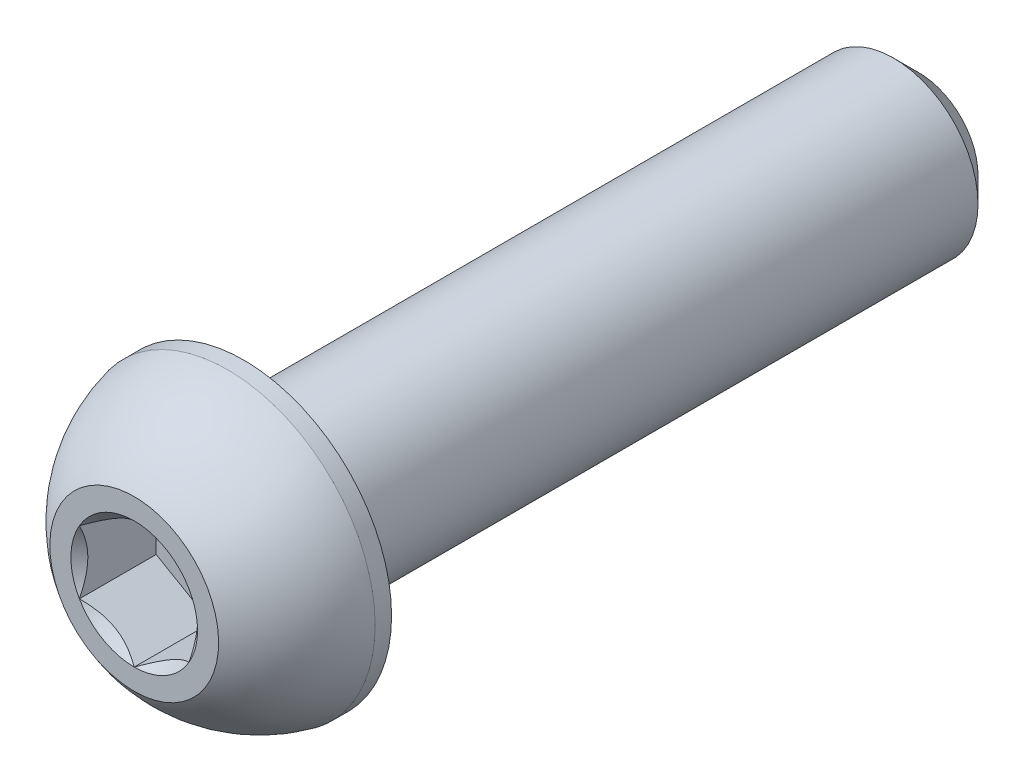
ISO-10303-21;
HEADER;
FILE_DESCRIPTION(('STEP AP214'),'2;1');
FILE_NAME('part.step','',(''),(''),'','','');
FILE_SCHEMA(('AUTOMOTIVE_DESIGN { 1 0 10303 214 1 1 1 1 }'));
ENDSEC;
DATA;
#1=APPLICATION_CONTEXT('core data for automotive mechanical design processes');
#2=APPLICATION_PROTOCOL_DEFINITION('international standard','automotive_design',2000,#1);
#3=PRODUCT_CONTEXT('',#1,'mechanical');
#4=PRODUCT('Part','Part','',(#3));
#5=PRODUCT_RELATED_PRODUCT_CATEGORY('part','',(#4));
#6=PRODUCT_DEFINITION_FORMATION('','',#4);
#7=PRODUCT_DEFINITION_CONTEXT('part definition',#1,'design');
#8=PRODUCT_DEFINITION('design','',#6,#7);
#9=PRODUCT_DEFINITION_SHAPE('','',#8);
#10=(LENGTH_UNIT() NAMED_UNIT(*) SI_UNIT(.MILLI.,.METRE.));
#11=(NAMED_UNIT(*) PLANE_ANGLE_UNIT() SI_UNIT($,.RADIAN.));
#12=(NAMED_UNIT(*) SI_UNIT($,.STERADIAN.) SOLID_ANGLE_UNIT());
#13=UNCERTAINTY_MEASURE_WITH_UNIT(LENGTH_MEASURE(1.E-05),#10,'distance_accuracy_value','');
#14=(GEOMETRIC_REPRESENTATION_CONTEXT(3) GLOBAL_UNCERTAINTY_ASSIGNED_CONTEXT((#13)) GLOBAL_UNIT_ASSIGNED_CONTEXT((#10,
#11,#12)) REPRESENTATION_CONTEXT('',''));
#15=CARTESIAN_POINT('',(0.,0.,0.));
#16=DIRECTION('',(0.,0.,1.));
#17=DIRECTION('',(1.,0.,0.));
#18=AXIS2_PLACEMENT_3D('',#15,#16,#17);
#19=CARTESIAN_POINT('',(0.,0.,-9.3));
#20=DIRECTION('',(0.,0.,1.));
#21=DIRECTION('',(1.,0.,0.));
#22=AXIS2_PLACEMENT_3D('',#19,#20,#21);
#23=PLANE('',#22);
#24=CARTESIAN_POINT('',(0.,0.,-9.3));
#25=DIRECTION('',(0.,0.,1.));
#26=DIRECTION('',(1.,0.,0.));
#27=AXIS2_PLACEMENT_3D('',#24,#25,#26);
#28=CIRCLE('',#27,0.700000000000034);
#29=CARTESIAN_POINT('',(0.700000000000034,0.,-9.3));
#30=VERTEX_POINT('',#29);
#31=EDGE_CURVE('E49',#30,#30,#28,.T.);
#32=ORIENTED_EDGE('',*,*,#31,.F.);
#33=EDGE_LOOP('',(#32));
#34=FACE_BOUND('',#33,.T.);
#35=ADVANCED_FACE('F36',(#34),#23,.F.);
#36=CARTESIAN_POINT('',(0.,0.,-9.3));
#37=DIRECTION('',(0.,0.,1.));
#38=DIRECTION('',(1.,0.,0.));
#39=AXIS2_PLACEMENT_3D('',#36,#37,#38);
#40=CONICAL_SURFACE('',#39,0.700000000000034,0.785398163397425);
#41=CARTESIAN_POINT('',(0.,0.,-9.00000000000001));
#42=DIRECTION('',(0.,0.,1.));
#43=DIRECTION('',(1.,0.,0.));
#44=AXIS2_PLACEMENT_3D('',#41,#42,#43);
#45=CIRCLE('',#44,1.00000000000001);
#46=CARTESIAN_POINT('',(1.00000000000001,0.,-9.00000000000001));
#47=VERTEX_POINT('',#46);
#48=EDGE_CURVE('E175',#47,#47,#45,.T.);
#49=ORIENTED_EDGE('',*,*,#48,.F.);
#50=EDGE_LOOP('',(#49));
#51=FACE_BOUND('',#50,.T.);
#52=ORIENTED_EDGE('',*,*,#31,.T.);
#53=EDGE_LOOP('',(#52));
#54=FACE_BOUND('',#53,.T.);
#55=ADVANCED_FACE('F180',(#51,#54),#40,.T.);
#56=CARTESIAN_POINT('',(0.,0.,0.));
#57=DIRECTION('',(0.,0.,1.));
#58=DIRECTION('',(1.,0.,0.));
#59=AXIS2_PLACEMENT_3D('',#56,#57,#58);
#60=CYLINDRICAL_SURFACE('',#59,1.00000000000001);
#61=CARTESIAN_POINT('',(0.,0.,-1.3));
#62=DIRECTION('',(0.,0.,1.));
#63=DIRECTION('',(1.,0.,0.));
#64=AXIS2_PLACEMENT_3D('',#61,#62,#63);
#65=CIRCLE('',#64,1.00000000000001);
#66=CARTESIAN_POINT('',(1.00000000000001,0.,-1.3));
#67=VERTEX_POINT('',#66);
#68=EDGE_CURVE('E172',#67,#67,#65,.T.);
#69=ORIENTED_EDGE('',*,*,#68,.F.);
#70=EDGE_LOOP('',(#69));
#71=FACE_BOUND('',#70,.T.);
#72=ORIENTED_EDGE('',*,*,#48,.T.);
#73=EDGE_LOOP('',(#72));
#74=FACE_BOUND('',#73,.T.);
#75=ADVANCED_FACE('F186',(#71,#74),#60,.T.);
#76=CARTESIAN_POINT('',(0.,-1.75,-1.3));
#77=DIRECTION('',(0.,0.,1.));
#78=DIRECTION('',(1.,0.,0.));
#79=AXIS2_PLACEMENT_3D('',#76,#77,#78);
#80=PLANE('',#79);
#81=CARTESIAN_POINT('',(0.,0.,-1.3));
#82=DIRECTION('',(0.,0.,1.));
#83=DIRECTION('',(1.,0.,0.));
#84=AXIS2_PLACEMENT_3D('',#81,#82,#83);
#85=CIRCLE('',#84,1.75);
#86=CARTESIAN_POINT('',(1.75,0.,-1.3));
#87=VERTEX_POINT('',#86);
#88=EDGE_CURVE('E166',#87,#87,#85,.T.);
#89=ORIENTED_EDGE('',*,*,#88,.F.);
#90=EDGE_LOOP('',(#89));
#91=FACE_BOUND('',#90,.T.);
#92=ORIENTED_EDGE('',*,*,#68,.T.);
#93=EDGE_LOOP('',(#92));
#94=FACE_BOUND('',#93,.T.);
#95=ADVANCED_FACE('F191',(#91,#94),#80,.F.);
#96=CARTESIAN_POINT('',(0.,0.,-1.48575791855203));
#97=DIRECTION('',(0.,0.,1.));
#98=DIRECTION('',(0.,-1.,0.));
#99=AXIS2_PLACEMENT_3D('',#96,#97,#98);
#100=SPHERICAL_SURFACE('',#99,1.79094293391502);
#101=CARTESIAN_POINT('',(0.,0.,0.));
#102=DIRECTION('',(0.,0.,1.));
#103=DIRECTION('',(1.,0.,0.));
#104=AXIS2_PLACEMENT_3D('',#101,#102,#103);
#105=CIRCLE('',#104,1.00000000000001);
#106=CARTESIAN_POINT('',(0.,-1.00000000000001,0.));
#107=VERTEX_POINT('',#106);
#108=EDGE_CURVE('E169',#107,#107,#105,.T.);
#109=CARTESIAN_POINT('',(0.,0.,-1.105));
#110=DIRECTION('',(0.,0.,1.));
#111=DIRECTION('',(1.,0.,0.));
#112=AXIS2_PLACEMENT_3D('',#109,#110,#111);
#113=CIRCLE('',#112,1.75);
#114=CARTESIAN_POINT('',(0.,-1.75,-1.105));
#115=VERTEX_POINT('',#114);
#116=EDGE_CURVE('E163',#115,#115,#113,.T.);
#117=CARTESIAN_POINT('',(0.,-1.00000000000001,0.));
#118=CARTESIAN_POINT('',(0.,-1.01182643004198,-0.00795982137329927));
#119=CARTESIAN_POINT('',(0.,-1.02355778185813,-0.0160609033918179));
#120=CARTESIAN_POINT('',(0.,-1.04682372823727,-0.0325408445171076));
#121=CARTESIAN_POINT('',(0.,-1.05835832280026,-0.0409197036238785));
#122=CARTESIAN_POINT('',(0.,-1.0812241538715,-0.0579504547234862));
#123=CARTESIAN_POINT('',(0.,-1.09255539037975,-0.0666023467163229));
#124=CARTESIAN_POINT('',(0.,-1.11500805055769,-0.0841742212604434));
#125=CARTESIAN_POINT('',(0.,-1.12612947422739,-0.0930942038117272));
#126=CARTESIAN_POINT('',(0.,-1.14815616552584,-0.111197175650233));
#127=CARTESIAN_POINT('',(0.,-1.1590614331546,-0.120380164937455));
#128=CARTESIAN_POINT('',(0.,-1.18064959458059,-0.139003913410275));
#129=CARTESIAN_POINT('',(0.,-1.19133248837781,-0.148444672595872));
#130=CARTESIAN_POINT('',(0.,-1.21246981057065,-0.167578577862459));
#131=CARTESIAN_POINT('',(0.,-1.22292423896626,-0.177271723943447));
#132=CARTESIAN_POINT('',(0.,-1.24359866921303,-0.196904875866591));
#133=CARTESIAN_POINT('',(0.,-1.2538186710642,-0.206844881708745));
#134=CARTESIAN_POINT('',(0.,-1.27401842070911,-0.226966085317752));
#135=CARTESIAN_POINT('',(0.,-1.28399816850286,-0.237147283084603));
#136=CARTESIAN_POINT('',(0.,-1.30371171952533,-0.257745065161795));
#137=CARTESIAN_POINT('',(0.,-1.31344552275405,-0.268161649472135));
#138=CARTESIAN_POINT('',(0.,-1.33266163437493,-0.289224265040536));
#139=CARTESIAN_POINT('',(0.,-1.34214394276707,-0.299870296298597));
#140=CARTESIAN_POINT('',(0.,-1.36085165784783,-0.321385735333565));
#141=CARTESIAN_POINT('',(0.,-1.37007706453644,-0.332255143110472));
#142=CARTESIAN_POINT('',(0.,-1.3882657158298,-0.354211137383978));
#143=CARTESIAN_POINT('',(0.,-1.39722896043454,-0.365297723880577));
#144=CARTESIAN_POINT('',(0.,-1.41488817666624,-0.387681753957667));
#145=CARTESIAN_POINT('',(0.,-1.42358414829318,-0.398979197538157));
#146=CARTESIAN_POINT('',(0.,-1.44070386007593,-0.421778499915324));
#147=CARTESIAN_POINT('',(0.,-1.44912760023172,-0.433280358712));
#148=CARTESIAN_POINT('',(0.,-1.46569804580678,-0.456481933095085));
#149=CARTESIAN_POINT('',(0.,-1.47384475122604,-0.468181648681495));
#150=CARTESIAN_POINT('',(0.,-1.48985648202944,-0.491772265398509));
#151=CARTESIAN_POINT('',(0.,-1.49772150741359,-0.503663166529114));
#152=CARTESIAN_POINT('',(0.,-1.51316539346377,-0.527629374073879));
#153=CARTESIAN_POINT('',(0.,-1.5207442541298,-0.539704680488038));
#154=CARTESIAN_POINT('',(0.,-1.53561148923356,-0.564032813190312));
#155=CARTESIAN_POINT('',(0.,-1.54289986367127,-0.576285639478425));
#156=CARTESIAN_POINT('',(0.,-1.55718197044511,-0.600961825296145));
#157=CARTESIAN_POINT('',(0.,-1.56417570278122,-0.61338518482575));
#158=CARTESIAN_POINT('',(0.,-1.57786453748518,-0.638395353254957));
#159=CARTESIAN_POINT('',(0.,-1.58455963985302,-0.650982162154558));
#160=CARTESIAN_POINT('',(0.,-1.59764739703439,-0.676312052252457));
#161=CARTESIAN_POINT('',(0.,-1.60404005184792,-0.689055133450757));
#162=CARTESIAN_POINT('',(0.,-1.61651926879161,-0.714690301967474));
#163=CARTESIAN_POINT('',(0.,-1.62260583092177,-0.727582389285892));
#164=CARTESIAN_POINT('',(0.,-1.63446939190682,-0.753508218899792));
#165=CARTESIAN_POINT('',(0.,-1.64024639076172,-0.766541961195273));
#166=CARTESIAN_POINT('',(0.,-1.65148753111412,-0.79274366884897));
#167=CARTESIAN_POINT('',(0.,-1.65695167261162,-0.805911634207186));
#168=CARTESIAN_POINT('',(0.,-1.66756398257888,-0.832374279532718));
#169=CARTESIAN_POINT('',(0.,-1.67271215104863,-0.845668959500033));
#170=CARTESIAN_POINT('',(0.,-1.68268957938988,-0.872377453353669));
#171=CARTESIAN_POINT('',(0.,-1.68751883926138,-0.885791267239989));
#172=CARTESIAN_POINT('',(0.,-1.69685569693965,-0.912730380247454));
#173=CARTESIAN_POINT('',(0.,-1.70136329474644,-0.926255679368598));
#174=CARTESIAN_POINT('',(0.,-1.7100542572701,-0.953410050828004));
#175=CARTESIAN_POINT('',(0.,-1.71423762198697,-0.967039123166265));
#176=CARTESIAN_POINT('',(0.,-1.72227773581392,-0.994393268989346));
#177=CARTESIAN_POINT('',(0.,-1.72613448492398,-1.00811834247417));
#178=CARTESIAN_POINT('',(0.,-1.73351915771601,-1.03565666706645));
#179=CARTESIAN_POINT('',(0.,-1.73704708139798,-1.04946991817391));
#180=CARTESIAN_POINT('',(0.,-1.74377213155194,-1.07717671194072));
#181=CARTESIAN_POINT('',(0.,-1.74696925802394,-1.09107025460008));
#182=CARTESIAN_POINT('',(0.,-1.75,-1.105));
#183=B_SPLINE_CURVE_WITH_KNOTS('',3,(#117,#118,#119,#120,#121,#122,#123,#124,#125,#126,#127,
#128,#129,#130,#131,#132,#133,#134,#135,#136,#137,#138,#139,#140,#141,#142,#143,#144,#145,#146,
#147,#148,#149,#150,#151,#152,#153,#154,#155,#156,#157,#158,#159,#160,#161,#162,#163,#164,#165,
#166,#167,#168,#169,#170,#171,#172,#173,#174,#175,#176,#177,#178,#179,#180,#181,#182),
.UNSPECIFIED.,.F.,.F.,(4,2,2,2,2,2,2,2,2,2,2,2,2,2,2,2,2,2,2,2,2,2,2,2,2,2,2,2,2,2,2,2,4),(0.,
0.0427658943058258,0.0855317886116518,0.128297682917478,0.171063577223303,0.213829471529129,
0.256595365834955,0.299361260140781,0.342127154446607,0.384893048752432,0.427658943058258,
0.470424837364084,0.51319073166991,0.555956625975736,0.598722520281562,0.641488414587387,
0.684254308893213,0.727020203199039,0.769786097504865,0.812551991810691,0.855317886116516,
0.898083780422342,0.940849674728168,0.983615569033994,1.02638146333982,1.06914735764565,
1.11191325195147,1.1546791462573,1.19744504056312,1.24021093486895,1.28297682917477,
1.3257427234806,1.36850861778643),.UNSPECIFIED.);
#184=EDGE_CURVE('BSEAM196',#107,#115,#183,.T.);
#185=ORIENTED_EDGE('',*,*,#108,.F.);
#186=ORIENTED_EDGE('',*,*,#116,.T.);
#187=ORIENTED_EDGE('',*,*,#184,.T.);
#188=ORIENTED_EDGE('',*,*,#184,.F.);
#189=EDGE_LOOP('',(#185,#187,#186,#188));
#190=FACE_BOUND('',#189,.T.);
#191=ADVANCED_FACE('F196',(#190),#100,.T.);
#192=CARTESIAN_POINT('',(0.,-1.00000000000001,0.));
#193=DIRECTION('',(0.,0.,-1.));
#194=DIRECTION('',(-1.,0.,0.));
#195=AXIS2_PLACEMENT_3D('',#192,#193,#194);
#196=PLANE('',#195);
#197=CARTESIAN_POINT('',(0.,0.,0.));
#198=DIRECTION('',(0.,0.,1.));
#199=DIRECTION('',(1.,0.,0.));
#200=AXIS2_PLACEMENT_3D('',#197,#198,#199);
#201=CIRCLE('',#200,0.750555349946512);
#202=CARTESIAN_POINT('',(-0.649999999999998,0.375277674973256,0.));
#203=VERTEX_POINT('',#202);
#204=CARTESIAN_POINT('',(-0.649999999999997,-0.375277674973259,0.));
#205=VERTEX_POINT('',#204);
#206=EDGE_CURVE('E62',#203,#205,#201,.T.);
#207=ORIENTED_EDGE('',*,*,#206,.F.);
#208=CARTESIAN_POINT('',(0.,0.750555349946512,0.));
#209=VERTEX_POINT('',#208);
#210=EDGE_CURVE('E134',#209,#203,#201,.T.);
#211=ORIENTED_EDGE('',*,*,#210,.F.);
#212=CARTESIAN_POINT('',(0.65,0.375277674973254,0.));
#213=VERTEX_POINT('',#212);
#214=EDGE_CURVE('E131',#213,#209,#201,.T.);
#215=ORIENTED_EDGE('',*,*,#214,.F.);
#216=CARTESIAN_POINT('',(0.65,-0.375277674973254,0.));
#217=VERTEX_POINT('',#216);
#218=EDGE_CURVE('E102',#217,#213,#201,.T.);
#219=ORIENTED_EDGE('',*,*,#218,.F.);
#220=CARTESIAN_POINT('',(0.,-0.750555349946512,0.));
#221=VERTEX_POINT('',#220);
#222=EDGE_CURVE('E94',#221,#217,#201,.T.);
#223=ORIENTED_EDGE('',*,*,#222,.F.);
#224=EDGE_CURVE('E55',#205,#221,#201,.T.);
#225=ORIENTED_EDGE('',*,*,#224,.F.);
#226=EDGE_LOOP('',(#207,#211,#215,#219,#223,#225));
#227=FACE_BOUND('',#226,.T.);
#228=ORIENTED_EDGE('',*,*,#108,.T.);
#229=EDGE_LOOP('',(#228));
#230=FACE_BOUND('',#229,.T.);
#231=ADVANCED_FACE('F128',(#227,#230),#196,.F.);
#232=CARTESIAN_POINT('',(0.,0.,0.));
#233=DIRECTION('',(0.,0.,1.));
#234=DIRECTION('',(1.,0.,0.));
#235=AXIS2_PLACEMENT_3D('',#232,#233,#234);
#236=CYLINDRICAL_SURFACE('',#235,1.75);
#237=ORIENTED_EDGE('',*,*,#116,.F.);
#238=EDGE_LOOP('',(#237));
#239=FACE_BOUND('',#238,.T.);
#240=ORIENTED_EDGE('',*,*,#88,.T.);
#241=EDGE_LOOP('',(#240));
#242=FACE_BOUND('',#241,.T.);
#243=ADVANCED_FACE('F202',(#239,#242),#236,.T.);
#244=CARTESIAN_POINT('',(0.,0.,0.));
#245=DIRECTION('',(0.,0.,1.));
#246=DIRECTION('',(1.,0.,0.));
#247=AXIS2_PLACEMENT_3D('',#244,#245,#246);
#248=CONICAL_SURFACE('',#247,0.750555349946512,0.78539816339745);
#249=ORIENTED_EDGE('',*,*,#218,.T.);
#250=CARTESIAN_POINT('',(0.65,-0.748456856201993,0.240750690384005));
#251=CARTESIAN_POINT('',(0.65,-0.711991073878816,0.213280285933621));
#252=CARTESIAN_POINT('',(0.65,-0.675139640082794,0.186265195476194));
#253=CARTESIAN_POINT('',(0.65,-0.600031183452819,0.133629348283163));
#254=CARTESIAN_POINT('',(0.65,-0.561765441270894,0.108021106129097));
#255=CARTESIAN_POINT('',(0.65,-0.481525479406319,0.0577374937624613));
#256=CARTESIAN_POINT('',(0.65,-0.439464253670484,0.0331988021987558));
#257=CARTESIAN_POINT('',(0.65,-0.353242719412717,-0.0116853403013637));
#258=CARTESIAN_POINT('',(0.65,-0.309090130602523,-0.0320449275105113));
#259=CARTESIAN_POINT('',(0.65,-0.242810057498668,-0.0569512709113473));
#260=CARTESIAN_POINT('',(0.65,-0.221667349821687,-0.0640992725852869));
#261=CARTESIAN_POINT('',(0.65,-0.178882845085541,-0.0767024705474531));
#262=CARTESIAN_POINT('',(0.65,-0.157241013753962,-0.0821575502168733));
#263=CARTESIAN_POINT('',(0.65,-0.0924732258239327,-0.0953392346897749));
#264=CARTESIAN_POINT('',(0.65,-0.0486986201802761,-0.100206440230559));
#265=CARTESIAN_POINT('',(0.65,0.0373331587621249,-0.10085551076922));
#266=CARTESIAN_POINT('',(0.65,0.0795879418799275,-0.0969596606801929));
#267=CARTESIAN_POINT('',(0.65,0.142230570834976,-0.0855076744021655));
#268=CARTESIAN_POINT('',(0.65,0.163174856664669,-0.080685435763269));
#269=CARTESIAN_POINT('',(0.65,0.204615212735414,-0.0693999000452562));
#270=CARTESIAN_POINT('',(0.65,0.225111320324617,-0.0629367402798553));
#271=CARTESIAN_POINT('',(0.65,0.289638534772371,-0.0401559078683569));
#272=CARTESIAN_POINT('',(0.65,0.332748206875051,-0.0212427548657985));
#273=CARTESIAN_POINT('',(0.65,0.416943840013234,0.0208112818887808));
#274=CARTESIAN_POINT('',(0.65,0.45802183453077,0.0439673547577785));
#275=CARTESIAN_POINT('',(0.65,0.53652923324599,0.0917266397180912));
#276=CARTESIAN_POINT('',(0.65,0.574038509134623,0.116200758127156));
#277=CARTESIAN_POINT('',(0.65,0.647609691485458,0.166623456014885));
#278=CARTESIAN_POINT('',(0.65,0.683680924535921,0.192558343655291));
#279=CARTESIAN_POINT('',(0.65,0.719356204751142,0.218966877397434));
#280=B_SPLINE_CURVE_WITH_KNOTS('',3,(#250,#251,#252,#253,#254,#255,#256,#257,#258,#259,#260,
#261,#262,#263,#264,#265,#266,#267,#268,#269,#270,#271,#272,#273,#274,#275,#276,#277,#278,#279),
.UNSPECIFIED.,.F.,.F.,(4,2,2,2,2,2,2,2,2,2,2,2,2,2,4),(0.,0.137014030009578,0.275096405762551,
0.421060359835522,0.566522128775089,0.633415056462916,0.7003125911218,0.831534924508334,
0.958010408789896,1.02242898521265,1.08684217280828,1.22766018796412,1.36899252873703,
1.50330165960873,1.63651263433843),.UNSPECIFIED.);
#281=EDGE_CURVE('E11',#217,#213,#280,.T.);
#282=ORIENTED_EDGE('',*,*,#281,.F.);
#283=EDGE_LOOP('',(#249,#282));
#284=FACE_BOUND('',#283,.T.);
#285=ADVANCED_FACE('F106',(#284),#248,.F.);
#286=ORIENTED_EDGE('',*,*,#214,.T.);
#287=CARTESIAN_POINT('',(0.6502,0.375162204919418,0.000115496696675192));
#288=CARTESIAN_POINT('',(0.62784612455738,0.388068220923646,-0.0127826378084528));
#289=CARTESIAN_POINT('',(0.605119879467388,0.401189224644023,-0.0249248451013623));
#290=CARTESIAN_POINT('',(0.558778015356718,0.427944712363067,-0.0471577551377729));
#291=CARTESIAN_POINT('',(0.535157980959404,0.441581745580624,-0.0572360751899923));
#292=CARTESIAN_POINT('',(0.487526191293144,0.469081972166423,-0.0744984835766245));
#293=CARTESIAN_POINT('',(0.463526635406914,0.482938122217769,-0.08172604148442));
#294=CARTESIAN_POINT('',(0.415010589754791,0.510948874235039,-0.0928707979999926));
#295=CARTESIAN_POINT('',(0.390495555958119,0.52510263559674,-0.0967962973781314));
#296=CARTESIAN_POINT('',(0.33061559766408,0.559674345636867,-0.101776562665292));
#297=CARTESIAN_POINT('',(0.295110807096765,0.580173046028428,-0.100875515207341));
#298=CARTESIAN_POINT('',(0.224845447682006,0.620740770201245,-0.0915914386833307));
#299=CARTESIAN_POINT('',(0.190086069560699,0.640809106516445,-0.083197236970343));
#300=CARTESIAN_POINT('',(0.129041737491061,0.676053068069352,-0.0629543214927018));
#301=CARTESIAN_POINT('',(0.102476138584915,0.691390723748998,-0.0521615767354971));
#302=CARTESIAN_POINT('',(0.0503858451009338,0.721465068714142,-0.0278480685503981));
#303=CARTESIAN_POINT('',(0.0248580811749648,0.736203530088609,-0.0143361789927107));
#304=CARTESIAN_POINT('',(-0.000199999999999354,0.75067082000035,0.000115496696673986));
#305=B_SPLINE_CURVE_WITH_KNOTS('',3,(#287,#288,#289,#290,#291,#292,#293,#294,#295,#296,#297,
#298,#299,#300,#301,#302,#303,#304),.UNSPECIFIED.,.F.,.F.,(4,2,2,2,2,2,2,2,4),(0.,
0.0866236559063445,0.173752711623243,0.259496442803569,0.345023980281753,0.467267720550126,
0.589694037029336,0.687111308755481,0.784215671813665),.UNSPECIFIED.);
#306=EDGE_CURVE('E133',#213,#209,#305,.T.);
#307=ORIENTED_EDGE('',*,*,#306,.F.);
#308=EDGE_LOOP('',(#286,#307));
#309=FACE_BOUND('',#308,.T.);
#310=ADVANCED_FACE('F289',(#309),#248,.F.);
#311=ORIENTED_EDGE('',*,*,#210,.T.);
#312=CARTESIAN_POINT('',(0.000200000000000687,0.75067082000035,0.000115496696674086));
#313=CARTESIAN_POINT('',(-0.0221538754426199,0.737764803996122,-0.0127826378084537));
#314=CARTESIAN_POINT('',(-0.0448801205326119,0.724643800275746,-0.0249248451013632));
#315=CARTESIAN_POINT('',(-0.0912219846432817,0.697888312556701,-0.0471577551377739));
#316=CARTESIAN_POINT('',(-0.114842019040596,0.684251279339144,-0.0572360751899933));
#317=CARTESIAN_POINT('',(-0.162473808706855,0.656751052753345,-0.0744984835766254));
#318=CARTESIAN_POINT('',(-0.186473364593085,0.642894902701999,-0.0817260414844208));
#319=CARTESIAN_POINT('',(-0.234989410245209,0.614884150684729,-0.0928707979999933));
#320=CARTESIAN_POINT('',(-0.25950444404188,0.600730389323028,-0.0967962973781321));
#321=CARTESIAN_POINT('',(-0.319384402335919,0.566158679282901,-0.101776562665293));
#322=CARTESIAN_POINT('',(-0.354889192903234,0.545659978891341,-0.100875515207342));
#323=CARTESIAN_POINT('',(-0.425154552317993,0.505092254718524,-0.0915914386833313));
#324=CARTESIAN_POINT('',(-0.4599139304393,0.485023918403323,-0.0831972369703435));
#325=CARTESIAN_POINT('',(-0.520958262508938,0.449779956850417,-0.0629543214927024));
#326=CARTESIAN_POINT('',(-0.547523861415084,0.43444230117077,-0.0521615767354977));
#327=CARTESIAN_POINT('',(-0.599614154899065,0.404367956205627,-0.0278480685503987));
#328=CARTESIAN_POINT('',(-0.625141918825034,0.389629494831159,-0.0143361789927112));
#329=CARTESIAN_POINT('',(-0.650199999999998,0.375162204919418,0.0001154966966736));
#330=B_SPLINE_CURVE_WITH_KNOTS('',3,(#312,#313,#314,#315,#316,#317,#318,#319,#320,#321,#322,
#323,#324,#325,#326,#327,#328,#329),.UNSPECIFIED.,.F.,.F.,(4,2,2,2,2,2,2,2,4),(0.,
0.0866236559063444,0.173752711623242,0.259496442803568,0.345023980281752,0.467267720550125,
0.589694037029335,0.68711130875548,0.784215671813665),.UNSPECIFIED.);
#331=EDGE_CURVE('E138',#209,#203,#330,.T.);
#332=ORIENTED_EDGE('',*,*,#331,.F.);
#333=EDGE_LOOP('',(#311,#332));
#334=FACE_BOUND('',#333,.T.);
#335=ADVANCED_FACE('F141',(#334),#248,.F.);
#336=ORIENTED_EDGE('',*,*,#206,.T.);
#337=CARTESIAN_POINT('',(-0.649999999999997,-0.748456856202,0.240750690384008));
#338=CARTESIAN_POINT('',(-0.649999999999997,-0.711991073878822,0.213280285933623));
#339=CARTESIAN_POINT('',(-0.649999999999997,-0.6751396400828,0.186265195476196));
#340=CARTESIAN_POINT('',(-0.649999999999997,-0.600031183452825,0.133629348283164));
#341=CARTESIAN_POINT('',(-0.649999999999997,-0.561765441270899,0.108021106129098));
#342=CARTESIAN_POINT('',(-0.649999999999997,-0.481525479406324,0.0577374937624617));
#343=CARTESIAN_POINT('',(-0.649999999999997,-0.439464253670489,0.0331988021987558));
#344=CARTESIAN_POINT('',(-0.649999999999997,-0.353242719412722,-0.0116853403013644));
#345=CARTESIAN_POINT('',(-0.649999999999997,-0.309090130602527,-0.0320449275105122));
#346=CARTESIAN_POINT('',(-0.649999999999997,-0.242810057498671,-0.0569512709113487));
#347=CARTESIAN_POINT('',(-0.649999999999998,-0.221667349821691,-0.0640992725852885));
#348=CARTESIAN_POINT('',(-0.649999999999998,-0.178882845085544,-0.076702470547455));
#349=CARTESIAN_POINT('',(-0.649999999999998,-0.157241013753965,-0.0821575502168752));
#350=CARTESIAN_POINT('',(-0.649999999999998,-0.092473225823936,-0.0953392346897771));
#351=CARTESIAN_POINT('',(-0.649999999999998,-0.0486986201802792,-0.100206440230561));
#352=CARTESIAN_POINT('',(-0.649999999999998,0.0373331587621221,-0.100855510769223));
#353=CARTESIAN_POINT('',(-0.649999999999998,0.0795879418799249,-0.0969596606801957));
#354=CARTESIAN_POINT('',(-0.649999999999998,0.142230570834973,-0.0855076744021684));
#355=CARTESIAN_POINT('',(-0.649999999999998,0.163174856664667,-0.080685435763272));
#356=CARTESIAN_POINT('',(-0.649999999999998,0.204615212735411,-0.0693999000452592));
#357=CARTESIAN_POINT('',(-0.649999999999998,0.225111320324615,-0.0629367402798583));
#358=CARTESIAN_POINT('',(-0.649999999999998,0.289638534772368,-0.0401559078683601));
#359=CARTESIAN_POINT('',(-0.649999999999998,0.332748206875048,-0.0212427548658018));
#360=CARTESIAN_POINT('',(-0.649999999999998,0.41694384001323,0.0208112818887772));
#361=CARTESIAN_POINT('',(-0.649999999999998,0.458021834530766,0.0439673547577745));
#362=CARTESIAN_POINT('',(-0.649999999999998,0.536529233245986,0.0917266397180868));
#363=CARTESIAN_POINT('',(-0.649999999999998,0.574038509134618,0.116200758127151));
#364=CARTESIAN_POINT('',(-0.649999999999999,0.647609691485453,0.166623456014881));
#365=CARTESIAN_POINT('',(-0.649999999999999,0.683680924535915,0.192558343655286));
#366=CARTESIAN_POINT('',(-0.649999999999999,0.719356204751137,0.218966877397429));
#367=B_SPLINE_CURVE_WITH_KNOTS('',3,(#337,#338,#339,#340,#341,#342,#343,#344,#345,#346,#347,
#348,#349,#350,#351,#352,#353,#354,#355,#356,#357,#358,#359,#360,#361,#362,#363,#364,#365,#366),
.UNSPECIFIED.,.F.,.F.,(4,2,2,2,2,2,2,2,2,2,2,2,2,2,4),(0.,0.13701403000958,0.275096405762553,
0.421060359835525,0.566522128775094,0.633415056462921,0.700312591121805,0.83153492450834,
0.958010408789902,1.02242898521266,1.08684217280828,1.22766018796413,1.36899252873703,
1.50330165960873,1.63651263433843),.UNSPECIFIED.);
#368=EDGE_CURVE('E145',#203,#205,#367,.F.);
#369=ORIENTED_EDGE('',*,*,#368,.F.);
#370=EDGE_LOOP('',(#336,#369));
#371=FACE_BOUND('',#370,.T.);
#372=ADVANCED_FACE('F283',(#371),#248,.F.);
#373=ORIENTED_EDGE('',*,*,#224,.T.);
#374=CARTESIAN_POINT('',(-0.650199999999997,-0.375162204919418,0.000115496696672807));
#375=CARTESIAN_POINT('',(-0.627846124557377,-0.388068220923647,-0.0127826378084549));
#376=CARTESIAN_POINT('',(-0.605119879467385,-0.401189224644023,-0.0249248451013643));
#377=CARTESIAN_POINT('',(-0.558778015356716,-0.427944712363067,-0.0471577551377746));
#378=CARTESIAN_POINT('',(-0.535157980959402,-0.441581745580625,-0.0572360751899938));
#379=CARTESIAN_POINT('',(-0.487526191293143,-0.469081972166423,-0.0744984835766257));
#380=CARTESIAN_POINT('',(-0.463526635406913,-0.482938122217769,-0.081726041484421));
#381=CARTESIAN_POINT('',(-0.41501058975479,-0.510948874235039,-0.0928707979999934));
#382=CARTESIAN_POINT('',(-0.390495555958118,-0.52510263559674,-0.096796297378132));
#383=CARTESIAN_POINT('',(-0.33061559766408,-0.559674345636867,-0.101776562665293));
#384=CARTESIAN_POINT('',(-0.295110807096765,-0.580173046028428,-0.100875515207342));
#385=CARTESIAN_POINT('',(-0.224845447682006,-0.620740770201245,-0.0915914386833309));
#386=CARTESIAN_POINT('',(-0.190086069560699,-0.640809106516445,-0.0831972369703432));
#387=CARTESIAN_POINT('',(-0.129041737491061,-0.676053068069351,-0.062954321492702));
#388=CARTESIAN_POINT('',(-0.102476138584916,-0.691390723748998,-0.0521615767354973));
#389=CARTESIAN_POINT('',(-0.0503858451009351,-0.721465068714141,-0.0278480685503986));
#390=CARTESIAN_POINT('',(-0.0248580811749664,-0.736203530088608,-0.0143361789927113));
#391=CARTESIAN_POINT('',(0.00019999999999743,-0.750670820000349,0.000115496696673118));
#392=B_SPLINE_CURVE_WITH_KNOTS('',3,(#374,#375,#376,#377,#378,#379,#380,#381,#382,#383,#384,
#385,#386,#387,#388,#389,#390,#391),.UNSPECIFIED.,.F.,.F.,(4,2,2,2,2,2,2,2,4),(0.,
0.0866236559063438,0.173752711623241,0.259496442803566,0.34502398028175,0.467267720550123,
0.589694037029333,0.687111308755476,0.78421567181366),.UNSPECIFIED.);
#393=EDGE_CURVE('E118',#205,#221,#392,.T.);
#394=ORIENTED_EDGE('',*,*,#393,.F.);
#395=EDGE_LOOP('',(#373,#394));
#396=FACE_BOUND('',#395,.T.);
#397=ADVANCED_FACE('F231',(#396),#248,.F.);
#398=ORIENTED_EDGE('',*,*,#222,.T.);
#399=CARTESIAN_POINT('',(-0.000200000000002532,-0.750670820000349,0.000115496696673219));
#400=CARTESIAN_POINT('',(0.0221538754426182,-0.737764803996121,-0.0127826378084547));
#401=CARTESIAN_POINT('',(0.0448801205326102,-0.724643800275745,-0.0249248451013643));
#402=CARTESIAN_POINT('',(0.0912219846432802,-0.6978883125567,-0.0471577551377752));
#403=CARTESIAN_POINT('',(0.114842019040594,-0.684251279339143,-0.0572360751899947));
#404=CARTESIAN_POINT('',(0.162473808706854,-0.656751052753344,-0.074498483576627));
#405=CARTESIAN_POINT('',(0.186473364593084,-0.642894902701998,-0.0817260414844226));
#406=CARTESIAN_POINT('',(0.234989410245208,-0.614884150684728,-0.0928707979999952));
#407=CARTESIAN_POINT('',(0.259504444041879,-0.600730389323027,-0.0967962973781341));
#408=CARTESIAN_POINT('',(0.319384402335918,-0.5661586792829,-0.101776562665295));
#409=CARTESIAN_POINT('',(0.354889192903233,-0.545659978891339,-0.100875515207344));
#410=CARTESIAN_POINT('',(0.425154552317992,-0.505092254718522,-0.0915914386833333));
#411=CARTESIAN_POINT('',(0.459913930439299,-0.485023918403322,-0.0831972369703457));
#412=CARTESIAN_POINT('',(0.520958262508937,-0.449779956850415,-0.0629543214927043));
#413=CARTESIAN_POINT('',(0.547523861415084,-0.434442301170768,-0.0521615767354993));
#414=CARTESIAN_POINT('',(0.599614154899066,-0.404367956205624,-0.0278480685503996));
#415=CARTESIAN_POINT('',(0.625141918825036,-0.389629494831156,-0.0143361789927117));
#416=CARTESIAN_POINT('',(0.6502,-0.375162204919414,0.000115496696673408));
#417=B_SPLINE_CURVE_WITH_KNOTS('',3,(#399,#400,#401,#402,#403,#404,#405,#406,#407,#408,#409,
#410,#411,#412,#413,#414,#415,#416),.UNSPECIFIED.,.F.,.F.,(4,2,2,2,2,2,2,2,4),(0.,
0.0866236559063447,0.173752711623243,0.259496442803569,0.345023980281754,0.467267720550126,
0.589694037029336,0.687111308755483,0.78421567181367),.UNSPECIFIED.);
#418=EDGE_CURVE('E98',#221,#217,#417,.T.);
#419=ORIENTED_EDGE('',*,*,#418,.F.);
#420=EDGE_LOOP('',(#398,#419));
#421=FACE_BOUND('',#420,.T.);
#422=ADVANCED_FACE('F96',(#421),#248,.F.);
#423=CARTESIAN_POINT('',(0.65,-0.375277674973252,-0.91));
#424=DIRECTION('',(0.,0.,1.));
#425=DIRECTION('',(1.,0.,0.));
#426=AXIS2_PLACEMENT_3D('',#423,#424,#425);
#427=PLANE('',#426);
#428=DIRECTION('',(0.866025403784438,0.5,0.));
#429=VECTOR('',#428,1.);
#430=CARTESIAN_POINT('',(0.,-0.750555349946511,-0.91));
#431=LINE('',#430,#429);
#432=CARTESIAN_POINT('',(0.,-0.750555349946511,-0.91));
#433=VERTEX_POINT('',#432);
#434=CARTESIAN_POINT('',(0.65,-0.375277674973252,-0.91));
#435=VERTEX_POINT('',#434);
#436=EDGE_CURVE('E117',#433,#435,#431,.T.);
#437=ORIENTED_EDGE('',*,*,#436,.T.);
#438=DIRECTION('',(0.,1.,0.));
#439=VECTOR('',#438,1.);
#440=CARTESIAN_POINT('',(0.65,-0.375277674973252,-0.91));
#441=LINE('',#440,#439);
#442=CARTESIAN_POINT('',(0.65,0.375277674973256,-0.91));
#443=VERTEX_POINT('',#442);
#444=EDGE_CURVE('E122',#435,#443,#441,.T.);
#445=ORIENTED_EDGE('',*,*,#444,.T.);
#446=DIRECTION('',(-0.866025403784439,0.5,0.));
#447=VECTOR('',#446,1.);
#448=CARTESIAN_POINT('',(0.65,0.375277674973256,-0.91));
#449=LINE('',#448,#447);
#450=CARTESIAN_POINT('',(0.,0.750555349946512,-0.91));
#451=VERTEX_POINT('',#450);
#452=EDGE_CURVE('E273',#443,#451,#449,.T.);
#453=ORIENTED_EDGE('',*,*,#452,.T.);
#454=DIRECTION('',(-0.866025403784439,-0.5,0.));
#455=VECTOR('',#454,1.);
#456=CARTESIAN_POINT('',(0.,0.750555349946512,-0.91));
#457=LINE('',#456,#455);
#458=CARTESIAN_POINT('',(-0.649999999999998,0.375277674973256,-0.91));
#459=VERTEX_POINT('',#458);
#460=EDGE_CURVE('E154',#451,#459,#457,.T.);
#461=ORIENTED_EDGE('',*,*,#460,.T.);
#462=DIRECTION('',(0.,-1.,0.));
#463=VECTOR('',#462,1.);
#464=CARTESIAN_POINT('',(-0.649999999999998,0.375277674973256,-0.91));
#465=LINE('',#464,#463);
#466=CARTESIAN_POINT('',(-0.649999999999997,-0.375277674973256,-0.91));
#467=VERTEX_POINT('',#466);
#468=EDGE_CURVE('E277',#459,#467,#465,.T.);
#469=ORIENTED_EDGE('',*,*,#468,.T.);
#470=DIRECTION('',(0.866025403784438,-0.500000000000001,0.));
#471=VECTOR('',#470,1.);
#472=CARTESIAN_POINT('',(-0.649999999999997,-0.375277674973256,-0.91));
#473=LINE('',#472,#471);
#474=EDGE_CURVE('E125',#467,#433,#473,.T.);
#475=ORIENTED_EDGE('',*,*,#474,.T.);
#476=EDGE_LOOP('',(#437,#445,#453,#461,#469,#475));
#477=FACE_BOUND('',#476,.T.);
#478=ADVANCED_FACE('F230',(#477),#427,.T.);
#479=CARTESIAN_POINT('',(0.65,-0.375277674973252,-0.91));
#480=DIRECTION('',(1.,0.,0.));
#481=DIRECTION('',(0.,0.,-1.));
#482=AXIS2_PLACEMENT_3D('',#479,#480,#481);
#483=PLANE('',#482);
#484=DIRECTION('',(0.,0.,1.));
#485=VECTOR('',#484,1.);
#486=CARTESIAN_POINT('',(0.65,-0.375277674973252,-0.91));
#487=LINE('',#486,#485);
#488=EDGE_CURVE('E114',#435,#217,#487,.T.);
#489=ORIENTED_EDGE('',*,*,#488,.T.);
#490=ORIENTED_EDGE('',*,*,#281,.T.);
#491=DIRECTION('',(0.,0.,1.));
#492=VECTOR('',#491,1.);
#493=CARTESIAN_POINT('',(0.65,0.375277674973256,-0.91));
#494=LINE('',#493,#492);
#495=EDGE_CURVE('E124',#443,#213,#494,.T.);
#496=ORIENTED_EDGE('',*,*,#495,.F.);
#497=ORIENTED_EDGE('',*,*,#444,.F.);
#498=EDGE_LOOP('',(#489,#490,#496,#497));
#499=FACE_BOUND('',#498,.T.);
#500=ADVANCED_FACE('F120',(#499),#483,.F.);
#501=CARTESIAN_POINT('',(0.65,0.375277674973256,-0.91));
#502=DIRECTION('',(0.5,0.866025403784439,0.));
#503=DIRECTION('',(-0.866025403784439,0.5,0.));
#504=AXIS2_PLACEMENT_3D('',#501,#502,#503);
#505=PLANE('',#504);
#506=ORIENTED_EDGE('',*,*,#495,.T.);
#507=ORIENTED_EDGE('',*,*,#306,.T.);
#508=DIRECTION('',(0.,0.,1.));
#509=VECTOR('',#508,1.);
#510=CARTESIAN_POINT('',(0.,0.750555349946512,-0.91));
#511=LINE('',#510,#509);
#512=EDGE_CURVE('E150',#451,#209,#511,.T.);
#513=ORIENTED_EDGE('',*,*,#512,.F.);
#514=ORIENTED_EDGE('',*,*,#452,.F.);
#515=EDGE_LOOP('',(#506,#507,#513,#514));
#516=FACE_BOUND('',#515,.T.);
#517=ADVANCED_FACE('F148',(#516),#505,.F.);
#518=CARTESIAN_POINT('',(0.,0.750555349946512,-0.91));
#519=DIRECTION('',(-0.5,0.866025403784439,0.));
#520=DIRECTION('',(-0.866025403784439,-0.5,0.));
#521=AXIS2_PLACEMENT_3D('',#518,#519,#520);
#522=PLANE('',#521);
#523=ORIENTED_EDGE('',*,*,#512,.T.);
#524=ORIENTED_EDGE('',*,*,#331,.T.);
#525=DIRECTION('',(0.,0.,1.));
#526=VECTOR('',#525,1.);
#527=CARTESIAN_POINT('',(-0.649999999999998,0.375277674973256,-0.91));
#528=LINE('',#527,#526);
#529=EDGE_CURVE('E156',#459,#203,#528,.T.);
#530=ORIENTED_EDGE('',*,*,#529,.F.);
#531=ORIENTED_EDGE('',*,*,#460,.F.);
#532=EDGE_LOOP('',(#523,#524,#530,#531));
#533=FACE_BOUND('',#532,.T.);
#534=ADVANCED_FACE('F152',(#533),#522,.F.);
#535=CARTESIAN_POINT('',(-0.649999999999998,0.375277674973256,-0.91));
#536=DIRECTION('',(-1.,0.,0.));
#537=DIRECTION('',(0.,-1.,0.));
#538=AXIS2_PLACEMENT_3D('',#535,#536,#537);
#539=PLANE('',#538);
#540=ORIENTED_EDGE('',*,*,#529,.T.);
#541=ORIENTED_EDGE('',*,*,#368,.T.);
#542=DIRECTION('',(0.,0.,1.));
#543=VECTOR('',#542,1.);
#544=CARTESIAN_POINT('',(-0.649999999999997,-0.375277674973256,-0.91));
#545=LINE('',#544,#543);
#546=EDGE_CURVE('E158',#467,#205,#545,.T.);
#547=ORIENTED_EDGE('',*,*,#546,.F.);
#548=ORIENTED_EDGE('',*,*,#468,.F.);
#549=EDGE_LOOP('',(#540,#541,#547,#548));
#550=FACE_BOUND('',#549,.T.);
#551=ADVANCED_FACE('F252',(#550),#539,.F.);
#552=CARTESIAN_POINT('',(-0.649999999999997,-0.375277674973256,-0.91));
#553=DIRECTION('',(-0.500000000000001,-0.866025403784438,0.));
#554=DIRECTION('',(0.866025403784438,-0.500000000000001,0.));
#555=AXIS2_PLACEMENT_3D('',#552,#553,#554);
#556=PLANE('',#555);
#557=ORIENTED_EDGE('',*,*,#546,.T.);
#558=ORIENTED_EDGE('',*,*,#393,.T.);
#559=DIRECTION('',(0.,0.,1.));
#560=VECTOR('',#559,1.);
#561=CARTESIAN_POINT('',(0.,-0.750555349946511,-0.91));
#562=LINE('',#561,#560);
#563=EDGE_CURVE('E116',#433,#221,#562,.T.);
#564=ORIENTED_EDGE('',*,*,#563,.F.);
#565=ORIENTED_EDGE('',*,*,#474,.F.);
#566=EDGE_LOOP('',(#557,#558,#564,#565));
#567=FACE_BOUND('',#566,.T.);
#568=ADVANCED_FACE('F211',(#567),#556,.F.);
#569=CARTESIAN_POINT('',(0.,-0.750555349946511,-0.91));
#570=DIRECTION('',(0.500000000000001,-0.866025403784438,0.));
#571=DIRECTION('',(0.866025403784438,0.500000000000001,0.));
#572=AXIS2_PLACEMENT_3D('',#569,#570,#571);
#573=PLANE('',#572);
#574=ORIENTED_EDGE('',*,*,#563,.T.);
#575=ORIENTED_EDGE('',*,*,#418,.T.);
#576=ORIENTED_EDGE('',*,*,#488,.F.);
#577=ORIENTED_EDGE('',*,*,#436,.F.);
#578=EDGE_LOOP('',(#574,#575,#576,#577));
#579=FACE_BOUND('',#578,.T.);
#580=ADVANCED_FACE('F112',(#579),#573,.F.);
#581=CLOSED_SHELL('',(#35,#55,#75,#95,#191,#231,#243,#285,#310,#335,#372,#397,#422,#478,#500,
#517,#534,#551,#568,#580));
#582=MANIFOLD_SOLID_BREP('B2',#581);
#583=ADVANCED_BREP_SHAPE_REPRESENTATION('',(#18,#582),#14);
#584=SHAPE_DEFINITION_REPRESENTATION(#9,#583);
ENDSEC;
END-ISO-10303-21;
